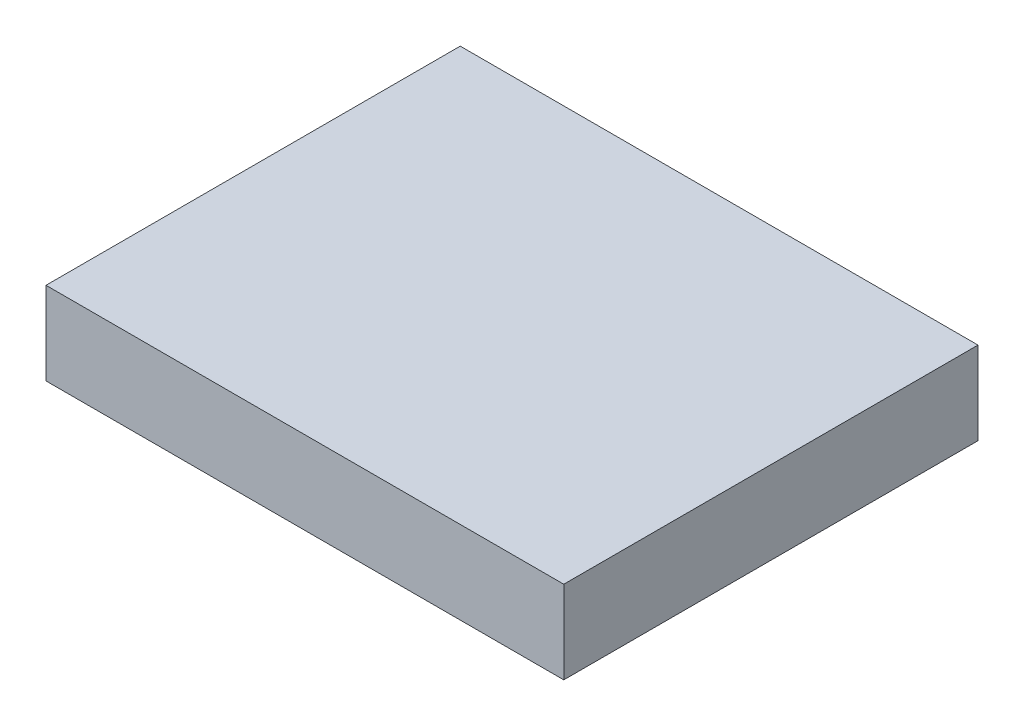
ISO-10303-21;
HEADER;
FILE_DESCRIPTION(('STEP AP214'),'2;1');
FILE_NAME('part.step','',(''),(''),'','','');
FILE_SCHEMA(('AUTOMOTIVE_DESIGN { 1 0 10303 214 1 1 1 1 }'));
ENDSEC;
DATA;
#1=APPLICATION_CONTEXT('core data for automotive mechanical design processes');
#2=APPLICATION_PROTOCOL_DEFINITION('international standard','automotive_design',2000,#1);
#3=PRODUCT_CONTEXT('',#1,'mechanical');
#4=PRODUCT('Part','Part','',(#3));
#5=PRODUCT_RELATED_PRODUCT_CATEGORY('part','',(#4));
#6=PRODUCT_DEFINITION_FORMATION('','',#4);
#7=PRODUCT_DEFINITION_CONTEXT('part definition',#1,'design');
#8=PRODUCT_DEFINITION('design','',#6,#7);
#9=PRODUCT_DEFINITION_SHAPE('','',#8);
#10=(LENGTH_UNIT() NAMED_UNIT(*) SI_UNIT(.MILLI.,.METRE.));
#11=(NAMED_UNIT(*) PLANE_ANGLE_UNIT() SI_UNIT($,.RADIAN.));
#12=(NAMED_UNIT(*) SI_UNIT($,.STERADIAN.) SOLID_ANGLE_UNIT());
#13=UNCERTAINTY_MEASURE_WITH_UNIT(LENGTH_MEASURE(1.E-05),#10,'distance_accuracy_value','');
#14=(GEOMETRIC_REPRESENTATION_CONTEXT(3) GLOBAL_UNCERTAINTY_ASSIGNED_CONTEXT((#13)) GLOBAL_UNIT_ASSIGNED_CONTEXT((#10,
#11,#12)) REPRESENTATION_CONTEXT('',''));
#15=CARTESIAN_POINT('',(0.,0.,0.));
#16=DIRECTION('',(0.,0.,1.));
#17=DIRECTION('',(1.,0.,0.));
#18=AXIS2_PLACEMENT_3D('',#15,#16,#17);
#19=CARTESIAN_POINT('',(12.5,4.,10.));
#20=DIRECTION('',(-1.,0.,0.));
#21=DIRECTION('',(0.,0.,1.));
#22=AXIS2_PLACEMENT_3D('',#19,#20,#21);
#23=PLANE('',#22);
#24=DIRECTION('',(0.,0.,-1.));
#25=VECTOR('',#24,1.);
#26=CARTESIAN_POINT('',(12.5,0.,10.));
#27=LINE('',#26,#25);
#28=CARTESIAN_POINT('',(12.5,0.,10.));
#29=VERTEX_POINT('',#28);
#30=CARTESIAN_POINT('',(12.5,0.,-10.));
#31=VERTEX_POINT('',#30);
#32=EDGE_CURVE('E111',#29,#31,#27,.T.);
#33=ORIENTED_EDGE('',*,*,#32,.T.);
#34=DIRECTION('',(0.,-1.,0.));
#35=VECTOR('',#34,1.);
#36=CARTESIAN_POINT('',(12.5,4.,-10.));
#37=LINE('',#36,#35);
#38=CARTESIAN_POINT('',(12.5,4.,-10.));
#39=VERTEX_POINT('',#38);
#40=EDGE_CURVE('E11',#39,#31,#37,.T.);
#41=ORIENTED_EDGE('',*,*,#40,.F.);
#42=DIRECTION('',(0.,0.,-1.));
#43=VECTOR('',#42,1.);
#44=CARTESIAN_POINT('',(12.5,4.,10.));
#45=LINE('',#44,#43);
#46=CARTESIAN_POINT('',(12.5,4.,10.));
#47=VERTEX_POINT('',#46);
#48=EDGE_CURVE('E95',#47,#39,#45,.T.);
#49=ORIENTED_EDGE('',*,*,#48,.F.);
#50=DIRECTION('',(0.,-1.,0.));
#51=VECTOR('',#50,1.);
#52=CARTESIAN_POINT('',(12.5,4.,10.));
#53=LINE('',#52,#51);
#54=EDGE_CURVE('E107',#47,#29,#53,.T.);
#55=ORIENTED_EDGE('',*,*,#54,.T.);
#56=EDGE_LOOP('',(#33,#41,#49,#55));
#57=FACE_BOUND('',#56,.T.);
#58=ADVANCED_FACE('F43',(#57),#23,.F.);
#59=CARTESIAN_POINT('',(-12.5,4.,-10.));
#60=DIRECTION('',(0.,0.,1.));
#61=DIRECTION('',(1.,0.,0.));
#62=AXIS2_PLACEMENT_3D('',#59,#60,#61);
#63=PLANE('',#62);
#64=DIRECTION('',(-1.,0.,0.));
#65=VECTOR('',#64,1.);
#66=CARTESIAN_POINT('',(-12.5,0.,-10.));
#67=LINE('',#66,#65);
#68=CARTESIAN_POINT('',(-12.5,0.,-10.));
#69=VERTEX_POINT('',#68);
#70=EDGE_CURVE('E100',#31,#69,#67,.T.);
#71=ORIENTED_EDGE('',*,*,#70,.T.);
#72=DIRECTION('',(0.,-1.,0.));
#73=VECTOR('',#72,1.);
#74=CARTESIAN_POINT('',(-12.5,4.,-10.));
#75=LINE('',#74,#73);
#76=CARTESIAN_POINT('',(-12.5,4.,-10.));
#77=VERTEX_POINT('',#76);
#78=EDGE_CURVE('E52',#77,#69,#75,.T.);
#79=ORIENTED_EDGE('',*,*,#78,.F.);
#80=DIRECTION('',(-1.,0.,0.));
#81=VECTOR('',#80,1.);
#82=CARTESIAN_POINT('',(-12.5,4.,-10.));
#83=LINE('',#82,#81);
#84=EDGE_CURVE('E90',#39,#77,#83,.T.);
#85=ORIENTED_EDGE('',*,*,#84,.F.);
#86=ORIENTED_EDGE('',*,*,#40,.T.);
#87=EDGE_LOOP('',(#71,#79,#85,#86));
#88=FACE_BOUND('',#87,.T.);
#89=ADVANCED_FACE('F99',(#88),#63,.F.);
#90=CARTESIAN_POINT('',(-12.5,4.,10.));
#91=DIRECTION('',(1.,0.,0.));
#92=DIRECTION('',(0.,0.,-1.));
#93=AXIS2_PLACEMENT_3D('',#90,#91,#92);
#94=PLANE('',#93);
#95=DIRECTION('',(0.,0.,1.));
#96=VECTOR('',#95,1.);
#97=CARTESIAN_POINT('',(-12.5,0.,10.));
#98=LINE('',#97,#96);
#99=CARTESIAN_POINT('',(-12.5,0.,10.));
#100=VERTEX_POINT('',#99);
#101=EDGE_CURVE('E77',#69,#100,#98,.T.);
#102=ORIENTED_EDGE('',*,*,#101,.T.);
#103=DIRECTION('',(0.,-1.,0.));
#104=VECTOR('',#103,1.);
#105=CARTESIAN_POINT('',(-12.5,4.,10.));
#106=LINE('',#105,#104);
#107=CARTESIAN_POINT('',(-12.5,4.,10.));
#108=VERTEX_POINT('',#107);
#109=EDGE_CURVE('E102',#108,#100,#106,.T.);
#110=ORIENTED_EDGE('',*,*,#109,.F.);
#111=DIRECTION('',(0.,0.,1.));
#112=VECTOR('',#111,1.);
#113=CARTESIAN_POINT('',(-12.5,4.,10.));
#114=LINE('',#113,#112);
#115=EDGE_CURVE('E93',#77,#108,#114,.T.);
#116=ORIENTED_EDGE('',*,*,#115,.F.);
#117=ORIENTED_EDGE('',*,*,#78,.T.);
#118=EDGE_LOOP('',(#102,#110,#116,#117));
#119=FACE_BOUND('',#118,.T.);
#120=ADVANCED_FACE('F103',(#119),#94,.F.);
#121=CARTESIAN_POINT('',(-12.5,4.,10.));
#122=DIRECTION('',(0.,0.,-1.));
#123=DIRECTION('',(-1.,0.,0.));
#124=AXIS2_PLACEMENT_3D('',#121,#122,#123);
#125=PLANE('',#124);
#126=DIRECTION('',(1.,0.,0.));
#127=VECTOR('',#126,1.);
#128=CARTESIAN_POINT('',(-12.5,0.,10.));
#129=LINE('',#128,#127);
#130=EDGE_CURVE('E83',#100,#29,#129,.T.);
#131=ORIENTED_EDGE('',*,*,#130,.T.);
#132=ORIENTED_EDGE('',*,*,#54,.F.);
#133=DIRECTION('',(1.,0.,0.));
#134=VECTOR('',#133,1.);
#135=CARTESIAN_POINT('',(-12.5,4.,10.));
#136=LINE('',#135,#134);
#137=EDGE_CURVE('E60',#108,#47,#136,.T.);
#138=ORIENTED_EDGE('',*,*,#137,.F.);
#139=ORIENTED_EDGE('',*,*,#109,.T.);
#140=EDGE_LOOP('',(#131,#132,#138,#139));
#141=FACE_BOUND('',#140,.T.);
#142=ADVANCED_FACE('F124',(#141),#125,.F.);
#143=CARTESIAN_POINT('',(0.,4.,0.));
#144=DIRECTION('',(0.,-1.,0.));
#145=DIRECTION('',(0.,0.,-1.));
#146=AXIS2_PLACEMENT_3D('',#143,#144,#145);
#147=PLANE('',#146);
#148=ORIENTED_EDGE('',*,*,#48,.T.);
#149=ORIENTED_EDGE('',*,*,#84,.T.);
#150=ORIENTED_EDGE('',*,*,#115,.T.);
#151=ORIENTED_EDGE('',*,*,#137,.T.);
#152=EDGE_LOOP('',(#148,#149,#150,#151));
#153=FACE_BOUND('',#152,.T.);
#154=ADVANCED_FACE('F91',(#153),#147,.F.);
#155=CARTESIAN_POINT('',(0.,0.,0.));
#156=DIRECTION('',(0.,-1.,0.));
#157=DIRECTION('',(0.,0.,-1.));
#158=AXIS2_PLACEMENT_3D('',#155,#156,#157);
#159=PLANE('',#158);
#160=ORIENTED_EDGE('',*,*,#32,.F.);
#161=ORIENTED_EDGE('',*,*,#130,.F.);
#162=ORIENTED_EDGE('',*,*,#101,.F.);
#163=ORIENTED_EDGE('',*,*,#70,.F.);
#164=EDGE_LOOP('',(#160,#161,#162,#163));
#165=FACE_BOUND('',#164,.T.);
#166=ADVANCED_FACE('F127',(#165),#159,.T.);
#167=CLOSED_SHELL('',(#58,#89,#120,#142,#154,#166));
#168=MANIFOLD_SOLID_BREP('B2',#167);
#169=ADVANCED_BREP_SHAPE_REPRESENTATION('',(#18,#168),#14);
#170=SHAPE_DEFINITION_REPRESENTATION(#9,#169);
ENDSEC;
END-ISO-10303-21;
